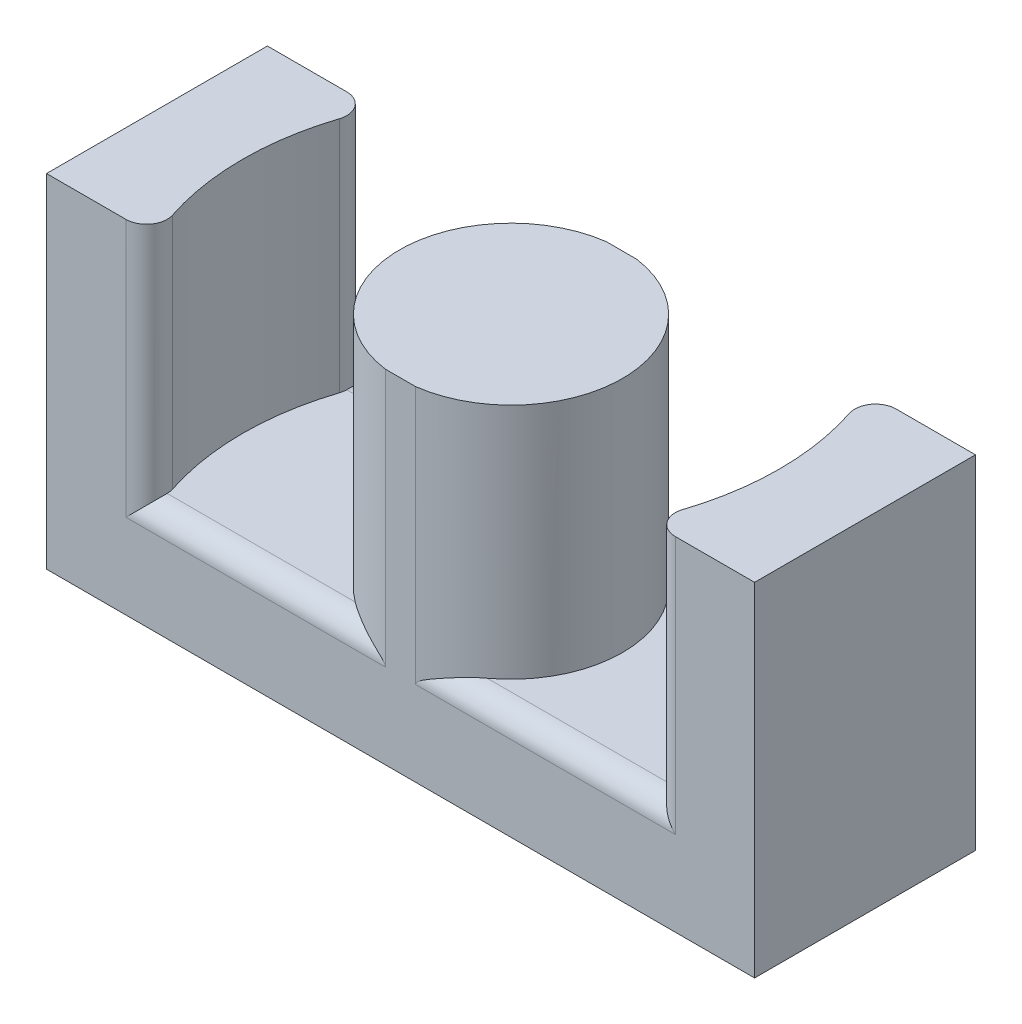
ISO-10303-21;
HEADER;
FILE_DESCRIPTION(('STEP AP214'),'2;1');
FILE_NAME('part.step','',(''),(''),'','','');
FILE_SCHEMA(('AUTOMOTIVE_DESIGN { 1 0 10303 214 1 1 1 1 }'));
ENDSEC;
DATA;
#1=APPLICATION_CONTEXT('core data for automotive mechanical design processes');
#2=APPLICATION_PROTOCOL_DEFINITION('international standard','automotive_design',2000,#1);
#3=PRODUCT_CONTEXT('',#1,'mechanical');
#4=PRODUCT('Part','Part','',(#3));
#5=PRODUCT_RELATED_PRODUCT_CATEGORY('part','',(#4));
#6=PRODUCT_DEFINITION_FORMATION('','',#4);
#7=PRODUCT_DEFINITION_CONTEXT('part definition',#1,'design');
#8=PRODUCT_DEFINITION('design','',#6,#7);
#9=PRODUCT_DEFINITION_SHAPE('','',#8);
#10=(LENGTH_UNIT() NAMED_UNIT(*) SI_UNIT(.MILLI.,.METRE.));
#11=(NAMED_UNIT(*) PLANE_ANGLE_UNIT() SI_UNIT($,.RADIAN.));
#12=(NAMED_UNIT(*) SI_UNIT($,.STERADIAN.) SOLID_ANGLE_UNIT());
#13=UNCERTAINTY_MEASURE_WITH_UNIT(LENGTH_MEASURE(1.E-05),#10,'distance_accuracy_value','');
#14=(GEOMETRIC_REPRESENTATION_CONTEXT(3) GLOBAL_UNCERTAINTY_ASSIGNED_CONTEXT((#13)) GLOBAL_UNIT_ASSIGNED_CONTEXT((#10,
#11,#12)) REPRESENTATION_CONTEXT('',''));
#15=CARTESIAN_POINT('',(0.,0.,0.));
#16=DIRECTION('',(0.,0.,1.));
#17=DIRECTION('',(1.,0.,0.));
#18=AXIS2_PLACEMENT_3D('',#15,#16,#17);
#19=CARTESIAN_POINT('',(0.,0.,0.));
#20=DIRECTION('',(0.,-1.,0.));
#21=DIRECTION('',(0.,0.,-1.));
#22=AXIS2_PLACEMENT_3D('',#19,#20,#21);
#23=PLANE('',#22);
#24=CARTESIAN_POINT('',(13.3070470052525,0.,-4.35));
#25=DIRECTION('',(0.,-1.,0.));
#26=DIRECTION('',(0.,0.,-1.));
#27=AXIS2_PLACEMENT_3D('',#24,#25,#26);
#28=CIRCLE('',#27,1.);
#29=CARTESIAN_POINT('',(12.3565436477345,0.,-4.03928571428571));
#30=VERTEX_POINT('',#29);
#31=CARTESIAN_POINT('',(12.3070470052525,0.,-4.35));
#32=VERTEX_POINT('',#31);
#33=EDGE_CURVE('E370',#30,#32,#28,.T.);
#34=ORIENTED_EDGE('',*,*,#33,.T.);
#35=DIRECTION('',(1.,0.,0.));
#36=VECTOR('',#35,1.);
#37=CARTESIAN_POINT('',(0.733143914930762,0.,-4.35));
#38=LINE('',#37,#36);
#39=CARTESIAN_POINT('',(3.19960935115523,0.,-4.35));
#40=VERTEX_POINT('',#39);
#41=EDGE_CURVE('E64',#32,#40,#38,.F.);
#42=ORIENTED_EDGE('',*,*,#41,.T.);
#43=CARTESIAN_POINT('',(0.,0.,0.));
#44=DIRECTION('',(0.,1.,0.));
#45=DIRECTION('',(0.,0.,1.));
#46=AXIS2_PLACEMENT_3D('',#43,#44,#45);
#47=CIRCLE('',#46,5.4);
#48=CARTESIAN_POINT('',(3.19960935115523,0.,4.35));
#49=VERTEX_POINT('',#48);
#50=EDGE_CURVE('E224',#49,#40,#47,.T.);
#51=ORIENTED_EDGE('',*,*,#50,.F.);
#52=DIRECTION('',(-1.,0.,0.));
#53=VECTOR('',#52,1.);
#54=CARTESIAN_POINT('',(0.,0.,4.35));
#55=LINE('',#54,#53);
#56=CARTESIAN_POINT('',(12.3070470052525,0.,4.35));
#57=VERTEX_POINT('',#56);
#58=EDGE_CURVE('E72',#49,#57,#55,.F.);
#59=ORIENTED_EDGE('',*,*,#58,.T.);
#60=CARTESIAN_POINT('',(13.3070470052525,0.,4.35));
#61=DIRECTION('',(0.,-1.,0.));
#62=DIRECTION('',(0.,0.,-1.));
#63=AXIS2_PLACEMENT_3D('',#60,#61,#62);
#64=CIRCLE('',#63,1.);
#65=CARTESIAN_POINT('',(12.3565436477345,0.,4.03928571428571));
#66=VERTEX_POINT('',#65);
#67=EDGE_CURVE('E367',#57,#66,#64,.T.);
#68=ORIENTED_EDGE('',*,*,#67,.T.);
#69=CARTESIAN_POINT('',(0.,0.,0.));
#70=DIRECTION('',(0.,1.,0.));
#71=DIRECTION('',(0.,0.,1.));
#72=AXIS2_PLACEMENT_3D('',#69,#70,#71);
#73=CIRCLE('',#72,13.);
#74=EDGE_CURVE('E228',#66,#30,#73,.T.);
#75=ORIENTED_EDGE('',*,*,#74,.T.);
#76=EDGE_LOOP('',(#34,#42,#51,#59,#68,#75));
#77=FACE_BOUND('',#76,.T.);
#78=ADVANCED_FACE('F45',(#77),#23,.F.);
#79=CARTESIAN_POINT('',(0.,11.5,0.));
#80=DIRECTION('',(0.,-1.,0.));
#81=DIRECTION('',(0.,0.,-1.));
#82=AXIS2_PLACEMENT_3D('',#79,#80,#81);
#83=CYLINDRICAL_SURFACE('',#82,13.);
#84=CARTESIAN_POINT('',(0.,11.5,0.));
#85=DIRECTION('',(0.,1.,0.));
#86=DIRECTION('',(0.,0.,1.));
#87=AXIS2_PLACEMENT_3D('',#84,#85,#86);
#88=CIRCLE('',#87,13.);
#89=CARTESIAN_POINT('',(-12.3565436477345,11.5,-4.03928571428571));
#90=VERTEX_POINT('',#89);
#91=CARTESIAN_POINT('',(-12.3565436477345,11.5,4.03928571428571));
#92=VERTEX_POINT('',#91);
#93=EDGE_CURVE('E274',#90,#92,#88,.T.);
#94=ORIENTED_EDGE('',*,*,#93,.T.);
#95=DIRECTION('',(0.,-1.,0.));
#96=VECTOR('',#95,1.);
#97=CARTESIAN_POINT('',(-12.3565436477345,11.5,4.03928571428571));
#98=LINE('',#97,#96);
#99=CARTESIAN_POINT('',(-12.3565436477345,0.,4.03928571428571));
#100=VERTEX_POINT('',#99);
#101=EDGE_CURVE('E301',#92,#100,#98,.T.);
#102=ORIENTED_EDGE('',*,*,#101,.T.);
#103=CARTESIAN_POINT('',(0.,0.,0.));
#104=DIRECTION('',(0.,1.,0.));
#105=DIRECTION('',(0.,0.,1.));
#106=AXIS2_PLACEMENT_3D('',#103,#104,#105);
#107=CIRCLE('',#106,13.);
#108=CARTESIAN_POINT('',(-12.3565436477345,0.,-4.03928571428571));
#109=VERTEX_POINT('',#108);
#110=EDGE_CURVE('E273',#109,#100,#107,.T.);
#111=ORIENTED_EDGE('',*,*,#110,.F.);
#112=DIRECTION('',(0.,-1.,0.));
#113=VECTOR('',#112,1.);
#114=CARTESIAN_POINT('',(-12.3565436477345,11.5,-4.03928571428571));
#115=LINE('',#114,#113);
#116=EDGE_CURVE('E298',#109,#90,#115,.F.);
#117=ORIENTED_EDGE('',*,*,#116,.T.);
#118=EDGE_LOOP('',(#94,#102,#111,#117));
#119=FACE_BOUND('',#118,.T.);
#120=ADVANCED_FACE('F429',(#119),#83,.F.);
#121=CARTESIAN_POINT('',(0.,11.5,-5.35));
#122=DIRECTION('',(0.,0.,-1.));
#123=DIRECTION('',(-1.,0.,0.));
#124=AXIS2_PLACEMENT_3D('',#121,#122,#123);
#125=PLANE('',#124);
#126=DIRECTION('',(1.,0.,0.));
#127=VECTOR('',#126,1.);
#128=CARTESIAN_POINT('',(0.,11.5,-5.35));
#129=LINE('',#128,#127);
#130=CARTESIAN_POINT('',(-17.15,11.5,-5.35));
#131=VERTEX_POINT('',#130);
#132=CARTESIAN_POINT('',(-13.3070470052525,11.5,-5.35));
#133=VERTEX_POINT('',#132);
#134=EDGE_CURVE('E278',#131,#133,#129,.T.);
#135=ORIENTED_EDGE('',*,*,#134,.T.);
#136=DIRECTION('',(0.,-1.,0.));
#137=VECTOR('',#136,1.);
#138=CARTESIAN_POINT('',(-13.3070470052525,11.5,-5.35));
#139=LINE('',#138,#137);
#140=CARTESIAN_POINT('',(-13.3070470052525,-1.,-5.35));
#141=VERTEX_POINT('',#140);
#142=EDGE_CURVE('E334',#133,#141,#139,.T.);
#143=ORIENTED_EDGE('',*,*,#142,.T.);
#144=DIRECTION('',(1.,0.,0.));
#145=VECTOR('',#144,1.);
#146=CARTESIAN_POINT('',(-0.733143914930775,-1.,-5.35));
#147=LINE('',#146,#145);
#148=CARTESIAN_POINT('',(-0.733143914930763,-1.,-5.35));
#149=VERTEX_POINT('',#148);
#150=EDGE_CURVE('E330',#141,#149,#147,.T.);
#151=ORIENTED_EDGE('',*,*,#150,.T.);
#152=DIRECTION('',(0.,-1.,0.));
#153=VECTOR('',#152,1.);
#154=CARTESIAN_POINT('',(-0.733143914930763,11.5,-5.35));
#155=LINE('',#154,#153);
#156=CARTESIAN_POINT('',(-0.733143914930763,11.5,-5.35));
#157=VERTEX_POINT('',#156);
#158=EDGE_CURVE('E251',#157,#149,#155,.T.);
#159=ORIENTED_EDGE('',*,*,#158,.F.);
#160=DIRECTION('',(1.,0.,0.));
#161=VECTOR('',#160,1.);
#162=CARTESIAN_POINT('',(0.,11.5,-5.35));
#163=LINE('',#162,#161);
#164=CARTESIAN_POINT('',(0.733143914930763,11.5,-5.35));
#165=VERTEX_POINT('',#164);
#166=EDGE_CURVE('E240',#157,#165,#163,.T.);
#167=ORIENTED_EDGE('',*,*,#166,.T.);
#168=DIRECTION('',(0.,-1.,0.));
#169=VECTOR('',#168,1.);
#170=CARTESIAN_POINT('',(0.733143914930763,11.5,-5.35));
#171=LINE('',#170,#169);
#172=CARTESIAN_POINT('',(0.733143914930763,-1.,-5.35));
#173=VERTEX_POINT('',#172);
#174=EDGE_CURVE('E254',#165,#173,#171,.T.);
#175=ORIENTED_EDGE('',*,*,#174,.T.);
#176=DIRECTION('',(1.,0.,0.));
#177=VECTOR('',#176,1.);
#178=CARTESIAN_POINT('',(11.8481011136806,-1.,-5.35));
#179=LINE('',#178,#177);
#180=CARTESIAN_POINT('',(13.3070470052525,-1.,-5.35));
#181=VERTEX_POINT('',#180);
#182=EDGE_CURVE('E324',#173,#181,#179,.T.);
#183=ORIENTED_EDGE('',*,*,#182,.T.);
#184=DIRECTION('',(0.,-1.,0.));
#185=VECTOR('',#184,1.);
#186=CARTESIAN_POINT('',(13.3070470052525,11.5,-5.35));
#187=LINE('',#186,#185);
#188=CARTESIAN_POINT('',(13.3070470052525,11.5,-5.35));
#189=VERTEX_POINT('',#188);
#190=EDGE_CURVE('E327',#181,#189,#187,.F.);
#191=ORIENTED_EDGE('',*,*,#190,.T.);
#192=DIRECTION('',(1.,0.,0.));
#193=VECTOR('',#192,1.);
#194=CARTESIAN_POINT('',(0.,11.5,-5.35));
#195=LINE('',#194,#193);
#196=CARTESIAN_POINT('',(17.15,11.5,-5.35));
#197=VERTEX_POINT('',#196);
#198=EDGE_CURVE('E218',#189,#197,#195,.T.);
#199=ORIENTED_EDGE('',*,*,#198,.T.);
#200=DIRECTION('',(0.,1.,0.));
#201=VECTOR('',#200,1.);
#202=CARTESIAN_POINT('',(17.15,-5.1,-5.35));
#203=LINE('',#202,#201);
#204=CARTESIAN_POINT('',(17.15,-5.1,-5.35));
#205=VERTEX_POINT('',#204);
#206=EDGE_CURVE('E212',#205,#197,#203,.T.);
#207=ORIENTED_EDGE('',*,*,#206,.F.);
#208=DIRECTION('',(1.,0.,0.));
#209=VECTOR('',#208,1.);
#210=CARTESIAN_POINT('',(17.15,-5.1,-5.35));
#211=LINE('',#210,#209);
#212=CARTESIAN_POINT('',(-17.15,-5.1,-5.35));
#213=VERTEX_POINT('',#212);
#214=EDGE_CURVE('E263',#213,#205,#211,.T.);
#215=ORIENTED_EDGE('',*,*,#214,.F.);
#216=DIRECTION('',(0.,-1.,0.));
#217=VECTOR('',#216,1.);
#218=CARTESIAN_POINT('',(-17.15,11.5,-5.35));
#219=LINE('',#218,#217);
#220=EDGE_CURVE('E295',#131,#213,#219,.T.);
#221=ORIENTED_EDGE('',*,*,#220,.F.);
#222=EDGE_LOOP('',(#135,#143,#151,#159,#167,#175,#183,#191,#199,#207,#215,#221));
#223=FACE_BOUND('',#222,.T.);
#224=ADVANCED_FACE('F432',(#223),#125,.T.);
#225=CARTESIAN_POINT('',(-17.15,11.5,0.));
#226=DIRECTION('',(1.,0.,0.));
#227=DIRECTION('',(0.,0.,-1.));
#228=AXIS2_PLACEMENT_3D('',#225,#226,#227);
#229=PLANE('',#228);
#230=ORIENTED_EDGE('',*,*,#220,.T.);
#231=DIRECTION('',(0.,0.,-1.));
#232=VECTOR('',#231,1.);
#233=CARTESIAN_POINT('',(-17.15,-5.1,-5.35));
#234=LINE('',#233,#232);
#235=CARTESIAN_POINT('',(-17.15,-5.1,5.35));
#236=VERTEX_POINT('',#235);
#237=EDGE_CURVE('E259',#236,#213,#234,.T.);
#238=ORIENTED_EDGE('',*,*,#237,.F.);
#239=DIRECTION('',(0.,-1.,0.));
#240=VECTOR('',#239,1.);
#241=CARTESIAN_POINT('',(-17.15,11.5,5.35));
#242=LINE('',#241,#240);
#243=CARTESIAN_POINT('',(-17.15,11.5,5.35));
#244=VERTEX_POINT('',#243);
#245=EDGE_CURVE('E289',#244,#236,#242,.T.);
#246=ORIENTED_EDGE('',*,*,#245,.F.);
#247=DIRECTION('',(0.,0.,1.));
#248=VECTOR('',#247,1.);
#249=CARTESIAN_POINT('',(-17.15,11.5,0.));
#250=LINE('',#249,#248);
#251=EDGE_CURVE('E282',#131,#244,#250,.T.);
#252=ORIENTED_EDGE('',*,*,#251,.F.);
#253=EDGE_LOOP('',(#230,#238,#246,#252));
#254=FACE_BOUND('',#253,.T.);
#255=ADVANCED_FACE('F436',(#254),#229,.F.);
#256=CARTESIAN_POINT('',(0.,11.5,5.35));
#257=DIRECTION('',(0.,0.,-1.));
#258=DIRECTION('',(-1.,0.,0.));
#259=AXIS2_PLACEMENT_3D('',#256,#257,#258);
#260=PLANE('',#259);
#261=DIRECTION('',(1.,0.,0.));
#262=VECTOR('',#261,1.);
#263=CARTESIAN_POINT('',(0.,11.5,5.35));
#264=LINE('',#263,#262);
#265=CARTESIAN_POINT('',(13.3070470052525,11.5,5.35));
#266=VERTEX_POINT('',#265);
#267=CARTESIAN_POINT('',(17.15,11.5,5.35));
#268=VERTEX_POINT('',#267);
#269=EDGE_CURVE('E188',#266,#268,#264,.T.);
#270=ORIENTED_EDGE('',*,*,#269,.F.);
#271=DIRECTION('',(0.,1.,0.));
#272=VECTOR('',#271,1.);
#273=CARTESIAN_POINT('',(13.3070470052525,0.,5.35));
#274=LINE('',#273,#272);
#275=CARTESIAN_POINT('',(13.3070470052525,-1.,5.35));
#276=VERTEX_POINT('',#275);
#277=EDGE_CURVE('E315',#266,#276,#274,.F.);
#278=ORIENTED_EDGE('',*,*,#277,.T.);
#279=DIRECTION('',(-1.,0.,0.));
#280=VECTOR('',#279,1.);
#281=CARTESIAN_POINT('',(0.,-1.,5.35));
#282=LINE('',#281,#280);
#283=CARTESIAN_POINT('',(0.733143914930775,-1.,5.35));
#284=VERTEX_POINT('',#283);
#285=EDGE_CURVE('E311',#276,#284,#282,.T.);
#286=ORIENTED_EDGE('',*,*,#285,.T.);
#287=DIRECTION('',(0.,-1.,0.));
#288=VECTOR('',#287,1.);
#289=CARTESIAN_POINT('',(0.733143914930775,11.5,5.35));
#290=LINE('',#289,#288);
#291=CARTESIAN_POINT('',(0.733143914930775,11.5,5.35));
#292=VERTEX_POINT('',#291);
#293=EDGE_CURVE('E257',#292,#284,#290,.T.);
#294=ORIENTED_EDGE('',*,*,#293,.F.);
#295=DIRECTION('',(1.,0.,0.));
#296=VECTOR('',#295,1.);
#297=CARTESIAN_POINT('',(0.,11.5,5.35));
#298=LINE('',#297,#296);
#299=CARTESIAN_POINT('',(-0.733143914930775,11.5,5.35));
#300=VERTEX_POINT('',#299);
#301=EDGE_CURVE('E233',#300,#292,#298,.T.);
#302=ORIENTED_EDGE('',*,*,#301,.F.);
#303=DIRECTION('',(0.,-1.,0.));
#304=VECTOR('',#303,1.);
#305=CARTESIAN_POINT('',(-0.733143914930775,11.5,5.35));
#306=LINE('',#305,#304);
#307=CARTESIAN_POINT('',(-0.733143914930775,-1.,5.35));
#308=VERTEX_POINT('',#307);
#309=EDGE_CURVE('E248',#300,#308,#306,.T.);
#310=ORIENTED_EDGE('',*,*,#309,.T.);
#311=DIRECTION('',(-1.,0.,0.));
#312=VECTOR('',#311,1.);
#313=CARTESIAN_POINT('',(0.,-1.,5.35));
#314=LINE('',#313,#312);
#315=CARTESIAN_POINT('',(-13.3070470052525,-1.,5.35));
#316=VERTEX_POINT('',#315);
#317=EDGE_CURVE('E305',#308,#316,#314,.T.);
#318=ORIENTED_EDGE('',*,*,#317,.T.);
#319=DIRECTION('',(0.,1.,0.));
#320=VECTOR('',#319,1.);
#321=CARTESIAN_POINT('',(-13.3070470052525,11.5,5.35));
#322=LINE('',#321,#320);
#323=CARTESIAN_POINT('',(-13.3070470052525,11.5,5.35));
#324=VERTEX_POINT('',#323);
#325=EDGE_CURVE('E308',#316,#324,#322,.T.);
#326=ORIENTED_EDGE('',*,*,#325,.T.);
#327=DIRECTION('',(1.,0.,0.));
#328=VECTOR('',#327,1.);
#329=CARTESIAN_POINT('',(0.,11.5,5.35));
#330=LINE('',#329,#328);
#331=EDGE_CURVE('E285',#244,#324,#330,.T.);
#332=ORIENTED_EDGE('',*,*,#331,.F.);
#333=ORIENTED_EDGE('',*,*,#245,.T.);
#334=DIRECTION('',(-1.,0.,0.));
#335=VECTOR('',#334,1.);
#336=CARTESIAN_POINT('',(17.15,-5.1,5.35));
#337=LINE('',#336,#335);
#338=CARTESIAN_POINT('',(17.15,-5.1,5.35));
#339=VERTEX_POINT('',#338);
#340=EDGE_CURVE('E208',#339,#236,#337,.T.);
#341=ORIENTED_EDGE('',*,*,#340,.F.);
#342=DIRECTION('',(0.,1.,0.));
#343=VECTOR('',#342,1.);
#344=CARTESIAN_POINT('',(17.15,-5.1,5.35));
#345=LINE('',#344,#343);
#346=EDGE_CURVE('E205',#339,#268,#345,.T.);
#347=ORIENTED_EDGE('',*,*,#346,.T.);
#348=EDGE_LOOP('',(#270,#278,#286,#294,#302,#310,#318,#326,#332,#333,#341,#347));
#349=FACE_BOUND('',#348,.T.);
#350=ADVANCED_FACE('F206',(#349),#260,.F.);
#351=CARTESIAN_POINT('',(0.,11.5,0.));
#352=DIRECTION('',(0.,1.,0.));
#353=DIRECTION('',(0.,0.,1.));
#354=AXIS2_PLACEMENT_3D('',#351,#352,#353);
#355=PLANE('',#354);
#356=ORIENTED_EDGE('',*,*,#331,.T.);
#357=CARTESIAN_POINT('',(-13.3070470052525,11.5,4.35));
#358=DIRECTION('',(0.,1.,0.));
#359=DIRECTION('',(0.,0.,1.));
#360=AXIS2_PLACEMENT_3D('',#357,#358,#359);
#361=CIRCLE('',#360,1.);
#362=EDGE_CURVE('E321',#324,#92,#361,.T.);
#363=ORIENTED_EDGE('',*,*,#362,.T.);
#364=ORIENTED_EDGE('',*,*,#93,.F.);
#365=CARTESIAN_POINT('',(-13.3070470052525,11.5,-4.35));
#366=DIRECTION('',(0.,1.,0.));
#367=DIRECTION('',(0.,0.,1.));
#368=AXIS2_PLACEMENT_3D('',#365,#366,#367);
#369=CIRCLE('',#368,1.);
#370=EDGE_CURVE('E318',#90,#133,#369,.T.);
#371=ORIENTED_EDGE('',*,*,#370,.T.);
#372=ORIENTED_EDGE('',*,*,#134,.F.);
#373=ORIENTED_EDGE('',*,*,#251,.T.);
#374=EDGE_LOOP('',(#356,#363,#364,#371,#372,#373));
#375=FACE_BOUND('',#374,.T.);
#376=ADVANCED_FACE('F443',(#375),#355,.T.);
#377=CARTESIAN_POINT('',(-3.19960935115523,0.,-4.35));
#378=VERTEX_POINT('',#377);
#379=CARTESIAN_POINT('',(-3.19960935115523,0.,4.35));
#380=VERTEX_POINT('',#379);
#381=EDGE_CURVE('E238',#378,#380,#47,.T.);
#382=ORIENTED_EDGE('',*,*,#381,.F.);
#383=DIRECTION('',(1.,0.,0.));
#384=VECTOR('',#383,1.);
#385=CARTESIAN_POINT('',(-11.8481011136806,0.,-4.35));
#386=LINE('',#385,#384);
#387=CARTESIAN_POINT('',(-12.3070470052525,0.,-4.35));
#388=VERTEX_POINT('',#387);
#389=EDGE_CURVE('E353',#378,#388,#386,.F.);
#390=ORIENTED_EDGE('',*,*,#389,.T.);
#391=CARTESIAN_POINT('',(-13.3070470052525,0.,-4.35));
#392=DIRECTION('',(0.,-1.,0.));
#393=DIRECTION('',(0.,0.,-1.));
#394=AXIS2_PLACEMENT_3D('',#391,#392,#393);
#395=CIRCLE('',#394,1.);
#396=EDGE_CURVE('E364',#388,#109,#395,.T.);
#397=ORIENTED_EDGE('',*,*,#396,.T.);
#398=ORIENTED_EDGE('',*,*,#110,.T.);
#399=CARTESIAN_POINT('',(-13.3070470052525,0.,4.35));
#400=DIRECTION('',(0.,-1.,0.));
#401=DIRECTION('',(0.,0.,-1.));
#402=AXIS2_PLACEMENT_3D('',#399,#400,#401);
#403=CIRCLE('',#402,1.);
#404=CARTESIAN_POINT('',(-12.3070470052525,0.,4.35));
#405=VERTEX_POINT('',#404);
#406=EDGE_CURVE('E360',#100,#405,#403,.T.);
#407=ORIENTED_EDGE('',*,*,#406,.T.);
#408=DIRECTION('',(-1.,0.,0.));
#409=VECTOR('',#408,1.);
#410=CARTESIAN_POINT('',(0.,0.,4.35));
#411=LINE('',#410,#409);
#412=EDGE_CURVE('E350',#405,#380,#411,.F.);
#413=ORIENTED_EDGE('',*,*,#412,.T.);
#414=EDGE_LOOP('',(#382,#390,#397,#398,#407,#413));
#415=FACE_BOUND('',#414,.T.);
#416=ADVANCED_FACE('F446',(#415),#23,.F.);
#417=CARTESIAN_POINT('',(17.15,-5.1,-5.35));
#418=DIRECTION('',(-1.,0.,0.));
#419=DIRECTION('',(0.,0.,1.));
#420=AXIS2_PLACEMENT_3D('',#417,#418,#419);
#421=PLANE('',#420);
#422=ORIENTED_EDGE('',*,*,#206,.T.);
#423=DIRECTION('',(0.,0.,1.));
#424=VECTOR('',#423,1.);
#425=CARTESIAN_POINT('',(17.15,11.5,0.));
#426=LINE('',#425,#424);
#427=EDGE_CURVE('E194',#197,#268,#426,.T.);
#428=ORIENTED_EDGE('',*,*,#427,.T.);
#429=ORIENTED_EDGE('',*,*,#346,.F.);
#430=DIRECTION('',(0.,0.,1.));
#431=VECTOR('',#430,1.);
#432=CARTESIAN_POINT('',(17.15,-5.1,-5.35));
#433=LINE('',#432,#431);
#434=EDGE_CURVE('E266',#205,#339,#433,.T.);
#435=ORIENTED_EDGE('',*,*,#434,.F.);
#436=EDGE_LOOP('',(#422,#428,#429,#435));
#437=FACE_BOUND('',#436,.T.);
#438=ADVANCED_FACE('F215',(#437),#421,.F.);
#439=CARTESIAN_POINT('',(0.,-5.1,0.));
#440=DIRECTION('',(0.,-1.,0.));
#441=DIRECTION('',(0.,0.,-1.));
#442=AXIS2_PLACEMENT_3D('',#439,#440,#441);
#443=PLANE('',#442);
#444=ORIENTED_EDGE('',*,*,#237,.T.);
#445=ORIENTED_EDGE('',*,*,#214,.T.);
#446=ORIENTED_EDGE('',*,*,#434,.T.);
#447=ORIENTED_EDGE('',*,*,#340,.T.);
#448=EDGE_LOOP('',(#444,#445,#446,#447));
#449=FACE_BOUND('',#448,.T.);
#450=ADVANCED_FACE('F450',(#449),#443,.T.);
#451=CARTESIAN_POINT('',(0.,11.5,0.));
#452=DIRECTION('',(0.,-1.,0.));
#453=DIRECTION('',(0.,0.,-1.));
#454=AXIS2_PLACEMENT_3D('',#451,#452,#453);
#455=CYLINDRICAL_SURFACE('',#454,5.4);
#456=ORIENTED_EDGE('',*,*,#293,.T.);
#457=CARTESIAN_POINT('',(0.733143914930775,-1.,5.35));
#458=CARTESIAN_POINT('',(0.733108448623755,-0.990835527830573,5.35000418973112));
#459=CARTESIAN_POINT('',(0.734061846454128,-0.981727708029263,5.34987426470078));
#460=CARTESIAN_POINT('',(0.737589665738002,-0.964003174148581,5.3493893438869));
#461=CARTESIAN_POINT('',(0.74013401405778,-0.955380514488626,5.34903852277749));
#462=CARTESIAN_POINT('',(0.747651662308779,-0.935656266594001,5.34799350995827));
#463=CARTESIAN_POINT('',(0.753168558230315,-0.924773099196329,5.34722133520561));
#464=CARTESIAN_POINT('',(0.765793986896437,-0.903914137995586,5.34542814147988));
#465=CARTESIAN_POINT('',(0.772915904167546,-0.893947029002602,5.34440502311278));
#466=CARTESIAN_POINT('',(0.801310573119021,-0.858231185935556,5.34025553686225));
#467=CARTESIAN_POINT('',(0.825694880580944,-0.835107365405235,5.33656006243247));
#468=CARTESIAN_POINT('',(0.876955408294385,-0.792060485040167,5.32838167760119));
#469=CARTESIAN_POINT('',(0.903846116635397,-0.772158119885988,5.32389403542708));
#470=CARTESIAN_POINT('',(0.961330114034236,-0.732627170070601,5.3138276617654));
#471=CARTESIAN_POINT('',(0.99203985564316,-0.713180865130362,5.30818734955191));
#472=CARTESIAN_POINT('',(1.05423125283793,-0.675791409900252,5.29618790606884));
#473=CARTESIAN_POINT('',(1.08571356467874,-0.657849599056877,5.28982814586344));
#474=CARTESIAN_POINT('',(1.18094410614895,-0.605555899401466,5.26968461092627));
#475=CARTESIAN_POINT('',(1.24535665868906,-0.572811379568809,5.25485717203282));
#476=CARTESIAN_POINT('',(1.37494359281369,-0.510036063216423,5.22245291538783));
#477=CARTESIAN_POINT('',(1.44011922930168,-0.480010762658615,5.20487071727786));
#478=CARTESIAN_POINT('',(1.57062369855448,-0.422313211164329,5.16698673593971));
#479=CARTESIAN_POINT('',(1.63595227317007,-0.394638325840075,5.14668806493566));
#480=CARTESIAN_POINT('',(1.80842941671119,-0.324417373817637,5.08943311027088));
#481=CARTESIAN_POINT('',(1.91556073677653,-0.283700918093784,5.05013552554076));
#482=CARTESIAN_POINT('',(2.12910490458626,-0.20853898863395,4.96388863427425));
#483=CARTESIAN_POINT('',(2.2355168464273,-0.174100368472166,4.91693106994679));
#484=CARTESIAN_POINT('',(2.44615892038144,-0.113034757750815,4.81558723605353));
#485=CARTESIAN_POINT('',(2.55039874279381,-0.0863584056468122,4.76125128177316));
#486=CARTESIAN_POINT('',(2.75649338954699,-0.0424763863173678,4.64496453634781));
#487=CARTESIAN_POINT('',(2.85835187564202,-0.0252551177254079,4.58302649695944));
#488=CARTESIAN_POINT('',(2.99926895837361,-0.00958421237127242,4.49074273502376));
#489=CARTESIAN_POINT('',(3.03977810100735,-0.0060580270538969,4.46342253909153));
#490=CARTESIAN_POINT('',(3.12018879277337,-0.00126643856551718,4.4075868665541));
#491=CARTESIAN_POINT('',(3.16008933426106,-4.45041049659108E-06,4.37906965070193));
#492=CARTESIAN_POINT('',(3.19960935115523,0.,4.35));
#493=B_SPLINE_CURVE_WITH_KNOTS('',3,(#457,#458,#459,#460,#461,#462,#463,#464,#465,#466,#467,
#468,#469,#470,#471,#472,#473,#474,#475,#476,#477,#478,#479,#480,#481,#482,#483,#484,#485,#486,
#487,#488,#489,#490,#491,#492),.UNSPECIFIED.,.F.,.F.,(4,2,2,2,2,2,2,2,2,2,2,2,2,2,2,2,2,4),(0.,
0.0273525667233022,0.054203109463615,0.0906716864261684,0.127456439472959,0.228068201085394,
0.329302632855226,0.439553998951254,0.549902501792145,0.771026583061848,0.992588055914548,
1.21389782805547,1.57696995825092,1.94043611455808,2.30153771793636,2.66204168083261,
2.80894498896821,2.95606968098091),.UNSPECIFIED.);
#494=EDGE_CURVE('E56',#284,#49,#493,.T.);
#495=ORIENTED_EDGE('',*,*,#494,.T.);
#496=ORIENTED_EDGE('',*,*,#50,.T.);
#497=CARTESIAN_POINT('',(3.19960935115523,0.,-4.35));
#498=CARTESIAN_POINT('',(3.13449727627011,-3.94838164165105E-05,-4.39790561561044));
#499=CARTESIAN_POINT('',(3.06836353993096,-0.00343833362558697,-4.44428422209401));
#500=CARTESIAN_POINT('',(2.93456028934626,-0.0159802128948645,-4.53373925794594));
#501=CARTESIAN_POINT('',(2.86689324976487,-0.0251145448210637,-4.5768205766857));
#502=CARTESIAN_POINT('',(2.73003895724399,-0.0482081631426101,-4.65975617455411));
#503=CARTESIAN_POINT('',(2.66084643353041,-0.0621879522558025,-4.69959583819741));
#504=CARTESIAN_POINT('',(2.52148960770075,-0.0942450010316543,-4.77581408205558));
#505=CARTESIAN_POINT('',(2.45132492544156,-0.112323908606723,-4.81219126192198));
#506=CARTESIAN_POINT('',(2.27277616233952,-0.162527739277449,-4.89989446911045));
#507=CARTESIAN_POINT('',(2.16390167141303,-0.197010652403855,-4.94888808862089));
#508=CARTESIAN_POINT('',(1.94512531436586,-0.272759431973034,-5.03889931766432));
#509=CARTESIAN_POINT('',(1.83522246973394,-0.314032549403988,-5.07990829737695));
#510=CARTESIAN_POINT('',(1.61555969022794,-0.402518359991724,-5.15396207700215));
#511=CARTESIAN_POINT('',(1.50580048053039,-0.449711003758999,-5.18703271128473));
#512=CARTESIAN_POINT('',(1.34216988893535,-0.525710245562828,-5.23084822801391));
#513=CARTESIAN_POINT('',(1.28783085192632,-0.551892216494035,-5.24448105132143));
#514=CARTESIAN_POINT('',(1.17984380427924,-0.606500892638677,-5.26982262534733));
#515=CARTESIAN_POINT('',(1.12619543841458,-0.634926385543841,-5.28153240480347));
#516=CARTESIAN_POINT('',(1.04823624865921,-0.679427964268611,-5.2973446794363));
#517=CARTESIAN_POINT('',(1.02330930071792,-0.694153195479968,-5.30221362034308));
#518=CARTESIAN_POINT('',(0.973992729286691,-0.724706525739534,-5.31149377130451));
#519=CARTESIAN_POINT('',(0.949603858615063,-0.740536055123028,-5.31590436857925));
#520=CARTESIAN_POINT('',(0.90244048368469,-0.773316193383627,-5.32411123666135));
#521=CARTESIAN_POINT('',(0.879640479337786,-0.790226877722408,-5.32792051337297));
#522=CARTESIAN_POINT('',(0.835782155764529,-0.826309926659987,-5.33497427396049));
#523=CARTESIAN_POINT('',(0.81471873647904,-0.845475235797918,-5.33822044502432));
#524=CARTESIAN_POINT('',(0.787929815721166,-0.875147573524799,-5.34221214519606));
#525=CARTESIAN_POINT('',(0.780512368832028,-0.884054595615883,-5.34329953053409));
#526=CARTESIAN_POINT('',(0.766712692230244,-0.902675484276671,-5.34529694480797));
#527=CARTESIAN_POINT('',(0.760330064365907,-0.912389038343639,-5.3462070419836));
#528=CARTESIAN_POINT('',(0.750280886637931,-0.930652586064356,-5.34762556028866));
#529=CARTESIAN_POINT('',(0.746325950674849,-0.939037496819842,-5.34817802890061));
#530=CARTESIAN_POINT('',(0.739810686161093,-0.956331864484236,-5.349083204891));
#531=CARTESIAN_POINT('',(0.737244926721647,-0.965239125587049,-5.34943669039847));
#532=CARTESIAN_POINT('',(0.734758354389463,-0.978533611239737,-5.3497785721907));
#533=CARTESIAN_POINT('',(0.734156754084372,-0.982796036236632,-5.34986113121403));
#534=CARTESIAN_POINT('',(0.733348048048282,-0.991371202064215,-5.34997202908816));
#535=CARTESIAN_POINT('',(0.733142100967865,-0.995684053575935,-5.35000020869264));
#536=CARTESIAN_POINT('',(0.73314391493568,-1.00000000000092,-5.35000000000016));
#537=B_SPLINE_CURVE_WITH_KNOTS('',3,(#497,#498,#499,#500,#501,#502,#503,#504,#505,#506,#507,
#508,#509,#510,#511,#512,#513,#514,#515,#516,#517,#518,#519,#520,#521,#522,#523,#524,#525,#526,
#527,#528,#529,#530,#531,#532,#533,#534,#535,#536),.UNSPECIFIED.,.F.,.F.,(4,2,2,2,2,2,2,2,2,2,2,
2,2,2,2,2,2,2,2,4),(0.,0.242302535785354,0.484238517960024,0.727210966734323,0.970281268129774,
1.34255828028434,1.71523544376371,2.08668281307744,2.27215547390075,2.4575285900988,
2.54558593922193,2.63375954117625,2.71963719700172,2.8052529250896,2.84012954037607,
2.87499270470468,2.90276612467511,2.93043016767628,2.94332970460247,2.95626695993346),.UNSPECIFIED.);
#538=EDGE_CURVE('E382',#40,#173,#537,.T.);
#539=ORIENTED_EDGE('',*,*,#538,.T.);
#540=ORIENTED_EDGE('',*,*,#174,.F.);
#541=CARTESIAN_POINT('',(0.,11.5,0.));
#542=DIRECTION('',(0.,1.,0.));
#543=DIRECTION('',(0.,0.,1.));
#544=AXIS2_PLACEMENT_3D('',#541,#542,#543);
#545=CIRCLE('',#544,5.4);
#546=EDGE_CURVE('E237',#292,#165,#545,.T.);
#547=ORIENTED_EDGE('',*,*,#546,.F.);
#548=EDGE_LOOP('',(#456,#495,#496,#539,#540,#547));
#549=FACE_BOUND('',#548,.T.);
#550=ADVANCED_FACE('F454',(#549),#455,.T.);
#551=ORIENTED_EDGE('',*,*,#158,.T.);
#552=CARTESIAN_POINT('',(-0.733143914930763,-1.,-5.35));
#553=CARTESIAN_POINT('',(-0.733108448623744,-0.990835527830573,-5.35000418973112));
#554=CARTESIAN_POINT('',(-0.734061846454117,-0.981727708029264,-5.34987426470078));
#555=CARTESIAN_POINT('',(-0.737589665737991,-0.964003174148581,-5.3493893438869));
#556=CARTESIAN_POINT('',(-0.740134014057769,-0.955380514488626,-5.34903852277749));
#557=CARTESIAN_POINT('',(-0.747651662308767,-0.935656266594002,-5.34799350995828));
#558=CARTESIAN_POINT('',(-0.753168558230304,-0.924773099196329,-5.34722133520561));
#559=CARTESIAN_POINT('',(-0.765793986896425,-0.903914137995586,-5.34542814147988));
#560=CARTESIAN_POINT('',(-0.772915904167533,-0.893947029002601,-5.34440502311278));
#561=CARTESIAN_POINT('',(-0.801310573119008,-0.858231185935551,-5.34025553686225));
#562=CARTESIAN_POINT('',(-0.825694880580937,-0.835107365405233,-5.33656006243247));
#563=CARTESIAN_POINT('',(-0.876955408294385,-0.792060485040164,-5.32838167760119));
#564=CARTESIAN_POINT('',(-0.903846116635397,-0.772158119885983,-5.32389403542709));
#565=CARTESIAN_POINT('',(-0.961330114034239,-0.732627170070592,-5.3138276617654));
#566=CARTESIAN_POINT('',(-0.992039855643167,-0.713180865130352,-5.30818734955191));
#567=CARTESIAN_POINT('',(-1.05423125283794,-0.675791409900239,-5.29618790606884));
#568=CARTESIAN_POINT('',(-1.08571356467875,-0.657849599056863,-5.28982814586344));
#569=CARTESIAN_POINT('',(-1.18094410614898,-0.605555899401448,-5.26968461092627));
#570=CARTESIAN_POINT('',(-1.24535665868909,-0.572811379568789,-5.25485717203281));
#571=CARTESIAN_POINT('',(-1.37494359281373,-0.5100360632164,-5.22245291538782));
#572=CARTESIAN_POINT('',(-1.44011922930172,-0.48001076265859,-5.20487071727784));
#573=CARTESIAN_POINT('',(-1.57062369855453,-0.422313211164301,-5.16698673593969));
#574=CARTESIAN_POINT('',(-1.63595227317013,-0.394638325840046,-5.14668806493564));
#575=CARTESIAN_POINT('',(-1.80842941671125,-0.32441737381761,-5.08943311027086));
#576=CARTESIAN_POINT('',(-1.9155607367766,-0.283700918093759,-5.05013552554073));
#577=CARTESIAN_POINT('',(-2.12910490458632,-0.208538988633929,-4.96388863427422));
#578=CARTESIAN_POINT('',(-2.23551684642736,-0.174100368472148,-4.91693106994677));
#579=CARTESIAN_POINT('',(-2.44615892038149,-0.113034757750801,-4.81558723605351));
#580=CARTESIAN_POINT('',(-2.55039874279386,-0.0863584056468002,-4.76125128177313));
#581=CARTESIAN_POINT('',(-2.75649338954703,-0.0424763863173594,-4.64496453634778));
#582=CARTESIAN_POINT('',(-2.85835187564206,-0.0252551177254013,-4.58302649695941));
#583=CARTESIAN_POINT('',(-2.99926895837364,-0.00958421237126937,-4.49074273502374));
#584=CARTESIAN_POINT('',(-3.03977810100737,-0.0060580270538951,-4.46342253909152));
#585=CARTESIAN_POINT('',(-3.12018879277338,-0.00126643856551703,-4.40758686655409));
#586=CARTESIAN_POINT('',(-3.16008933426106,-4.45041049681723E-06,-4.37906965070193));
#587=CARTESIAN_POINT('',(-3.19960935115523,0.,-4.35));
#588=B_SPLINE_CURVE_WITH_KNOTS('',3,(#552,#553,#554,#555,#556,#557,#558,#559,#560,#561,#562,
#563,#564,#565,#566,#567,#568,#569,#570,#571,#572,#573,#574,#575,#576,#577,#578,#579,#580,#581,
#582,#583,#584,#585,#586,#587),.UNSPECIFIED.,.F.,.F.,(4,2,2,2,2,2,2,2,2,2,2,2,2,2,2,2,2,4),(0.,
0.0273525667233015,0.0542031094636143,0.0906716864261683,0.12745643947296,0.228068201085401,
0.32930263285524,0.439553998951278,0.549902501792177,0.771026583061901,0.992588055914617,
1.21389782805556,1.576969958251,1.94043611455815,2.30153771793642,2.66204168083266,
2.80894498896824,2.95606968098091),.UNSPECIFIED.);
#589=EDGE_CURVE('E373',#149,#378,#588,.T.);
#590=ORIENTED_EDGE('',*,*,#589,.T.);
#591=ORIENTED_EDGE('',*,*,#381,.T.);
#592=CARTESIAN_POINT('',(-3.19960935115523,0.,4.35));
#593=CARTESIAN_POINT('',(-3.13449727627011,-3.9483816416515E-05,4.39790561561044));
#594=CARTESIAN_POINT('',(-3.06836353993097,-0.00343833362558695,4.44428422209401));
#595=CARTESIAN_POINT('',(-2.93456028934627,-0.0159802128948644,4.53373925794594));
#596=CARTESIAN_POINT('',(-2.86689324976487,-0.0251145448210636,4.5768205766857));
#597=CARTESIAN_POINT('',(-2.73003895724399,-0.0482081631426099,4.65975617455411));
#598=CARTESIAN_POINT('',(-2.66084643353042,-0.0621879522558025,4.69959583819741));
#599=CARTESIAN_POINT('',(-2.52148960770076,-0.0942450010316544,4.77581408205558));
#600=CARTESIAN_POINT('',(-2.45132492544156,-0.112323908606723,4.81219126192198));
#601=CARTESIAN_POINT('',(-2.27277616233952,-0.162527739277449,4.89989446911045));
#602=CARTESIAN_POINT('',(-2.16390167141304,-0.197010652403855,4.94888808862089));
#603=CARTESIAN_POINT('',(-1.94512531436587,-0.272759431973033,5.03889931766432));
#604=CARTESIAN_POINT('',(-1.83522246973395,-0.314032549403987,5.07990829737695));
#605=CARTESIAN_POINT('',(-1.61555969022795,-0.402518359991723,5.15396207700215));
#606=CARTESIAN_POINT('',(-1.5058004805304,-0.449711003758998,5.18703271128473));
#607=CARTESIAN_POINT('',(-1.34216988893536,-0.525710245562826,5.23084822801391));
#608=CARTESIAN_POINT('',(-1.28783085192633,-0.551892216494033,5.24448105132143));
#609=CARTESIAN_POINT('',(-1.17984380427925,-0.606500892638676,5.26982262534732));
#610=CARTESIAN_POINT('',(-1.12619543841459,-0.63492638554384,5.28153240480347));
#611=CARTESIAN_POINT('',(-1.04823624865922,-0.679427964268608,5.2973446794363));
#612=CARTESIAN_POINT('',(-1.02330930071794,-0.694153195479964,5.30221362034307));
#613=CARTESIAN_POINT('',(-0.973992729286706,-0.724706525739529,5.3114937713045));
#614=CARTESIAN_POINT('',(-0.94960385861508,-0.740536055123024,5.31590436857925));
#615=CARTESIAN_POINT('',(-0.902440483684709,-0.773316193383622,5.32411123666134));
#616=CARTESIAN_POINT('',(-0.879640479337806,-0.790226877722401,5.32792051337297));
#617=CARTESIAN_POINT('',(-0.835782155764551,-0.826309926659978,5.33497427396048));
#618=CARTESIAN_POINT('',(-0.814718736479064,-0.845475235797907,5.33822044502432));
#619=CARTESIAN_POINT('',(-0.787929815721189,-0.875147573524785,5.34221214519606));
#620=CARTESIAN_POINT('',(-0.780512368832049,-0.884054595615868,5.34329953053409));
#621=CARTESIAN_POINT('',(-0.766712692230263,-0.902675484276657,5.34529694480796));
#622=CARTESIAN_POINT('',(-0.760330064365926,-0.912389038343626,5.34620704198359));
#623=CARTESIAN_POINT('',(-0.750280886637952,-0.930652586064346,5.34762556028866));
#624=CARTESIAN_POINT('',(-0.74632595067487,-0.939037496819832,5.3481780289006));
#625=CARTESIAN_POINT('',(-0.73981068616111,-0.956331864484227,5.349083204891));
#626=CARTESIAN_POINT('',(-0.73724492672166,-0.965239125587039,5.34943669039847));
#627=CARTESIAN_POINT('',(-0.734758354389475,-0.978533611239729,5.3497785721907));
#628=CARTESIAN_POINT('',(-0.734156754084385,-0.982796036236626,5.34986113121403));
#629=CARTESIAN_POINT('',(-0.733348048048294,-0.991371202064213,5.34997202908816));
#630=CARTESIAN_POINT('',(-0.733142100967877,-0.995684053575934,5.35000020869264));
#631=CARTESIAN_POINT('',(-0.733143914935689,-1.00000000000092,5.35000000000016));
#632=B_SPLINE_CURVE_WITH_KNOTS('',3,(#592,#593,#594,#595,#596,#597,#598,#599,#600,#601,#602,
#603,#604,#605,#606,#607,#608,#609,#610,#611,#612,#613,#614,#615,#616,#617,#618,#619,#620,#621,
#622,#623,#624,#625,#626,#627,#628,#629,#630,#631),.UNSPECIFIED.,.F.,.F.,(4,2,2,2,2,2,2,2,2,2,2,
2,2,2,2,2,2,2,2,4),(0.,0.242302535785354,0.484238517960023,0.727210966734322,0.970281268129774,
1.34255828028434,1.7152354437637,2.08668281307743,2.27215547390074,2.45752859009879,
2.54558593922192,2.63375954117624,2.7196371970017,2.80525292508958,2.84012954037605,
2.87499270470465,2.90276612467509,2.93043016767626,2.94332970460245,2.95626695993346),.UNSPECIFIED.);
#633=EDGE_CURVE('E11',#380,#308,#632,.T.);
#634=ORIENTED_EDGE('',*,*,#633,.T.);
#635=ORIENTED_EDGE('',*,*,#309,.F.);
#636=EDGE_CURVE('E241',#157,#300,#545,.T.);
#637=ORIENTED_EDGE('',*,*,#636,.F.);
#638=EDGE_LOOP('',(#551,#590,#591,#634,#635,#637));
#639=FACE_BOUND('',#638,.T.);
#640=ADVANCED_FACE('F388',(#639),#455,.T.);
#641=CARTESIAN_POINT('',(0.,11.5,0.));
#642=DIRECTION('',(0.,1.,0.));
#643=DIRECTION('',(0.,0.,1.));
#644=AXIS2_PLACEMENT_3D('',#641,#642,#643);
#645=PLANE('',#644);
#646=ORIENTED_EDGE('',*,*,#301,.T.);
#647=ORIENTED_EDGE('',*,*,#546,.T.);
#648=ORIENTED_EDGE('',*,*,#166,.F.);
#649=ORIENTED_EDGE('',*,*,#636,.T.);
#650=EDGE_LOOP('',(#646,#647,#648,#649));
#651=FACE_BOUND('',#650,.T.);
#652=ADVANCED_FACE('F576',(#651),#645,.T.);
#653=CARTESIAN_POINT('',(0.,11.5,0.));
#654=DIRECTION('',(0.,-1.,0.));
#655=DIRECTION('',(0.,0.,-1.));
#656=AXIS2_PLACEMENT_3D('',#653,#654,#655);
#657=CYLINDRICAL_SURFACE('',#656,13.);
#658=ORIENTED_EDGE('',*,*,#74,.F.);
#659=DIRECTION('',(0.,-1.,0.));
#660=VECTOR('',#659,1.);
#661=CARTESIAN_POINT('',(12.3565436477345,11.5,4.03928571428571));
#662=LINE('',#661,#660);
#663=CARTESIAN_POINT('',(12.3565436477345,11.5,4.03928571428571));
#664=VERTEX_POINT('',#663);
#665=EDGE_CURVE('E342',#66,#664,#662,.F.);
#666=ORIENTED_EDGE('',*,*,#665,.T.);
#667=CARTESIAN_POINT('',(0.,11.5,0.));
#668=DIRECTION('',(0.,1.,0.));
#669=DIRECTION('',(0.,0.,1.));
#670=AXIS2_PLACEMENT_3D('',#667,#668,#669);
#671=CIRCLE('',#670,13.);
#672=CARTESIAN_POINT('',(12.3565436477345,11.5,-4.03928571428571));
#673=VERTEX_POINT('',#672);
#674=EDGE_CURVE('E201',#664,#673,#671,.T.);
#675=ORIENTED_EDGE('',*,*,#674,.T.);
#676=DIRECTION('',(0.,-1.,0.));
#677=VECTOR('',#676,1.);
#678=CARTESIAN_POINT('',(12.3565436477345,11.5,-4.03928571428571));
#679=LINE('',#678,#677);
#680=EDGE_CURVE('E338',#673,#30,#679,.T.);
#681=ORIENTED_EDGE('',*,*,#680,.T.);
#682=EDGE_LOOP('',(#658,#666,#675,#681));
#683=FACE_BOUND('',#682,.T.);
#684=ADVANCED_FACE('F625',(#683),#657,.F.);
#685=CARTESIAN_POINT('',(0.,11.5,0.));
#686=DIRECTION('',(0.,1.,0.));
#687=DIRECTION('',(0.,0.,1.));
#688=AXIS2_PLACEMENT_3D('',#685,#686,#687);
#689=PLANE('',#688);
#690=ORIENTED_EDGE('',*,*,#674,.F.);
#691=CARTESIAN_POINT('',(13.3070470052525,11.5,4.35));
#692=DIRECTION('',(0.,1.,0.));
#693=DIRECTION('',(0.,0.,1.));
#694=AXIS2_PLACEMENT_3D('',#691,#692,#693);
#695=CIRCLE('',#694,1.);
#696=EDGE_CURVE('E196',#664,#266,#695,.T.);
#697=ORIENTED_EDGE('',*,*,#696,.T.);
#698=ORIENTED_EDGE('',*,*,#269,.T.);
#699=ORIENTED_EDGE('',*,*,#427,.F.);
#700=ORIENTED_EDGE('',*,*,#198,.F.);
#701=CARTESIAN_POINT('',(13.3070470052525,11.5,-4.35));
#702=DIRECTION('',(0.,1.,0.));
#703=DIRECTION('',(0.,0.,1.));
#704=AXIS2_PLACEMENT_3D('',#701,#702,#703);
#705=CIRCLE('',#704,1.);
#706=EDGE_CURVE('E345',#189,#673,#705,.T.);
#707=ORIENTED_EDGE('',*,*,#706,.T.);
#708=EDGE_LOOP('',(#690,#697,#698,#699,#700,#707));
#709=FACE_BOUND('',#708,.T.);
#710=ADVANCED_FACE('F191',(#709),#689,.T.);
#711=CARTESIAN_POINT('',(0.,-1.,4.35));
#712=DIRECTION('',(-1.,0.,0.));
#713=DIRECTION('',(0.,0.,1.));
#714=AXIS2_PLACEMENT_3D('',#711,#712,#713);
#715=CYLINDRICAL_SURFACE('',#714,1.);
#716=ORIENTED_EDGE('',*,*,#412,.F.);
#717=CARTESIAN_POINT('',(-13.3070470052525,-1.,4.35));
#718=DIRECTION('',(0.707106781186547,-0.707106781186547,0.));
#719=DIRECTION('',(-0.707106781186547,-0.707106781186547,0.));
#720=AXIS2_PLACEMENT_3D('',#717,#718,#719);
#721=ELLIPSE('',#720,1.41421356237309,1.);
#722=EDGE_CURVE('E232',#316,#405,#721,.F.);
#723=ORIENTED_EDGE('',*,*,#722,.F.);
#724=ORIENTED_EDGE('',*,*,#317,.F.);
#725=ORIENTED_EDGE('',*,*,#633,.F.);
#726=EDGE_LOOP('',(#716,#723,#724,#725));
#727=FACE_BOUND('',#726,.T.);
#728=ADVANCED_FACE('F421',(#727),#715,.T.);
#729=CARTESIAN_POINT('',(-13.3070470052525,11.5,4.35));
#730=DIRECTION('',(0.,-1.,0.));
#731=DIRECTION('',(0.,0.,-1.));
#732=AXIS2_PLACEMENT_3D('',#729,#730,#731);
#733=CYLINDRICAL_SURFACE('',#732,1.);
#734=ORIENTED_EDGE('',*,*,#362,.F.);
#735=ORIENTED_EDGE('',*,*,#325,.F.);
#736=ORIENTED_EDGE('',*,*,#722,.T.);
#737=ORIENTED_EDGE('',*,*,#406,.F.);
#738=ORIENTED_EDGE('',*,*,#101,.F.);
#739=EDGE_LOOP('',(#734,#735,#736,#737,#738));
#740=FACE_BOUND('',#739,.T.);
#741=ADVANCED_FACE('F398',(#740),#733,.T.);
#742=CARTESIAN_POINT('',(0.,-1.,-4.35));
#743=DIRECTION('',(-1.,0.,0.));
#744=DIRECTION('',(0.,0.,1.));
#745=AXIS2_PLACEMENT_3D('',#742,#743,#744);
#746=CYLINDRICAL_SURFACE('',#745,1.);
#747=ORIENTED_EDGE('',*,*,#589,.F.);
#748=ORIENTED_EDGE('',*,*,#150,.F.);
#749=CARTESIAN_POINT('',(-13.3070470052525,-1.,-4.35));
#750=DIRECTION('',(0.707106781186547,-0.707106781186547,0.));
#751=DIRECTION('',(-0.707106781186547,-0.707106781186547,0.));
#752=AXIS2_PLACEMENT_3D('',#749,#750,#751);
#753=ELLIPSE('',#752,1.41421356237309,1.);
#754=EDGE_CURVE('E474',#388,#141,#753,.F.);
#755=ORIENTED_EDGE('',*,*,#754,.F.);
#756=ORIENTED_EDGE('',*,*,#389,.F.);
#757=EDGE_LOOP('',(#747,#748,#755,#756));
#758=FACE_BOUND('',#757,.T.);
#759=ADVANCED_FACE('F392',(#758),#746,.T.);
#760=CARTESIAN_POINT('',(-13.3070470052525,11.5,-4.35));
#761=DIRECTION('',(0.,-1.,0.));
#762=DIRECTION('',(0.,0.,-1.));
#763=AXIS2_PLACEMENT_3D('',#760,#761,#762);
#764=CYLINDRICAL_SURFACE('',#763,1.);
#765=ORIENTED_EDGE('',*,*,#370,.F.);
#766=ORIENTED_EDGE('',*,*,#116,.F.);
#767=ORIENTED_EDGE('',*,*,#396,.F.);
#768=ORIENTED_EDGE('',*,*,#754,.T.);
#769=ORIENTED_EDGE('',*,*,#142,.F.);
#770=EDGE_LOOP('',(#765,#766,#767,#768,#769));
#771=FACE_BOUND('',#770,.T.);
#772=ADVANCED_FACE('F397',(#771),#764,.T.);
#773=CARTESIAN_POINT('',(0.,-1.,4.35));
#774=DIRECTION('',(-1.,0.,0.));
#775=DIRECTION('',(0.,0.,1.));
#776=AXIS2_PLACEMENT_3D('',#773,#774,#775);
#777=CYLINDRICAL_SURFACE('',#776,1.);
#778=ORIENTED_EDGE('',*,*,#494,.F.);
#779=ORIENTED_EDGE('',*,*,#285,.F.);
#780=CARTESIAN_POINT('',(13.3070470052525,-1.,4.35));
#781=DIRECTION('',(-0.707106781186547,-0.707106781186547,0.));
#782=DIRECTION('',(0.707106781186547,-0.707106781186547,0.));
#783=AXIS2_PLACEMENT_3D('',#780,#781,#782);
#784=ELLIPSE('',#783,1.41421356237309,1.);
#785=EDGE_CURVE('E471',#57,#276,#784,.F.);
#786=ORIENTED_EDGE('',*,*,#785,.F.);
#787=ORIENTED_EDGE('',*,*,#58,.F.);
#788=EDGE_LOOP('',(#778,#779,#786,#787));
#789=FACE_BOUND('',#788,.T.);
#790=ADVANCED_FACE('F404',(#789),#777,.T.);
#791=CARTESIAN_POINT('',(13.3070470052525,11.5,4.35));
#792=DIRECTION('',(0.,-1.,0.));
#793=DIRECTION('',(0.,0.,-1.));
#794=AXIS2_PLACEMENT_3D('',#791,#792,#793);
#795=CYLINDRICAL_SURFACE('',#794,1.);
#796=ORIENTED_EDGE('',*,*,#696,.F.);
#797=ORIENTED_EDGE('',*,*,#665,.F.);
#798=ORIENTED_EDGE('',*,*,#67,.F.);
#799=ORIENTED_EDGE('',*,*,#785,.T.);
#800=ORIENTED_EDGE('',*,*,#277,.F.);
#801=EDGE_LOOP('',(#796,#797,#798,#799,#800));
#802=FACE_BOUND('',#801,.T.);
#803=ADVANCED_FACE('F401',(#802),#795,.T.);
#804=CARTESIAN_POINT('',(0.,-1.,-4.35));
#805=DIRECTION('',(-1.,0.,0.));
#806=DIRECTION('',(0.,0.,1.));
#807=AXIS2_PLACEMENT_3D('',#804,#805,#806);
#808=CYLINDRICAL_SURFACE('',#807,1.);
#809=ORIENTED_EDGE('',*,*,#41,.F.);
#810=CARTESIAN_POINT('',(13.3070470052525,-1.,-4.35));
#811=DIRECTION('',(-0.707106781186547,-0.707106781186547,0.));
#812=DIRECTION('',(0.707106781186547,-0.707106781186547,0.));
#813=AXIS2_PLACEMENT_3D('',#810,#811,#812);
#814=ELLIPSE('',#813,1.41421356237309,1.);
#815=EDGE_CURVE('E50',#181,#32,#814,.F.);
#816=ORIENTED_EDGE('',*,*,#815,.F.);
#817=ORIENTED_EDGE('',*,*,#182,.F.);
#818=ORIENTED_EDGE('',*,*,#538,.F.);
#819=EDGE_LOOP('',(#809,#816,#817,#818));
#820=FACE_BOUND('',#819,.T.);
#821=ADVANCED_FACE('F47',(#820),#808,.T.);
#822=CARTESIAN_POINT('',(13.3070470052525,11.5,-4.35));
#823=DIRECTION('',(0.,-1.,0.));
#824=DIRECTION('',(0.,0.,-1.));
#825=AXIS2_PLACEMENT_3D('',#822,#823,#824);
#826=CYLINDRICAL_SURFACE('',#825,1.);
#827=ORIENTED_EDGE('',*,*,#706,.F.);
#828=ORIENTED_EDGE('',*,*,#190,.F.);
#829=ORIENTED_EDGE('',*,*,#815,.T.);
#830=ORIENTED_EDGE('',*,*,#33,.F.);
#831=ORIENTED_EDGE('',*,*,#680,.F.);
#832=EDGE_LOOP('',(#827,#828,#829,#830,#831));
#833=FACE_BOUND('',#832,.T.);
#834=ADVANCED_FACE('F409',(#833),#826,.T.);
#835=CLOSED_SHELL('',(#78,#120,#224,#255,#350,#376,#416,#438,#450,#550,#640,#652,#684,#710,#728,
#741,#759,#772,#790,#803,#821,#834));
#836=MANIFOLD_SOLID_BREP('B2',#835);
#837=ADVANCED_BREP_SHAPE_REPRESENTATION('',(#18,#836),#14);
#838=SHAPE_DEFINITION_REPRESENTATION(#9,#837);
ENDSEC;
END-ISO-10303-21;
